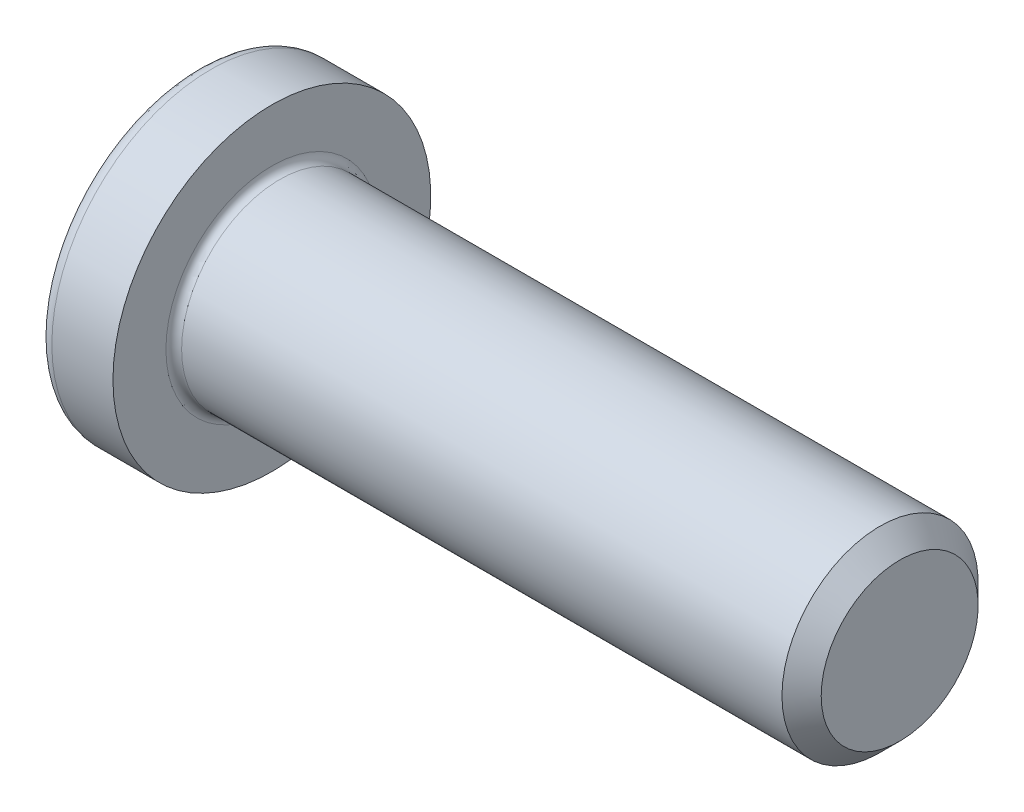
ISO-10303-21;
HEADER;
FILE_DESCRIPTION(('STEP AP214'),'2;1');
FILE_NAME('part.step','',(''),(''),'','','');
FILE_SCHEMA(('AUTOMOTIVE_DESIGN { 1 0 10303 214 1 1 1 1 }'));
ENDSEC;
DATA;
#1=APPLICATION_CONTEXT('core data for automotive mechanical design processes');
#2=APPLICATION_PROTOCOL_DEFINITION('international standard','automotive_design',2000,#1);
#3=PRODUCT_CONTEXT('',#1,'mechanical');
#4=PRODUCT('Part','Part','',(#3));
#5=PRODUCT_RELATED_PRODUCT_CATEGORY('part','',(#4));
#6=PRODUCT_DEFINITION_FORMATION('','',#4);
#7=PRODUCT_DEFINITION_CONTEXT('part definition',#1,'design');
#8=PRODUCT_DEFINITION('design','',#6,#7);
#9=PRODUCT_DEFINITION_SHAPE('','',#8);
#10=(LENGTH_UNIT() NAMED_UNIT(*) SI_UNIT(.MILLI.,.METRE.));
#11=(NAMED_UNIT(*) PLANE_ANGLE_UNIT() SI_UNIT($,.RADIAN.));
#12=(NAMED_UNIT(*) SI_UNIT($,.STERADIAN.) SOLID_ANGLE_UNIT());
#13=UNCERTAINTY_MEASURE_WITH_UNIT(LENGTH_MEASURE(1.E-05),#10,'distance_accuracy_value','');
#14=(GEOMETRIC_REPRESENTATION_CONTEXT(3) GLOBAL_UNCERTAINTY_ASSIGNED_CONTEXT((#13)) GLOBAL_UNIT_ASSIGNED_CONTEXT((#10,
#11,#12)) REPRESENTATION_CONTEXT('',''));
#15=CARTESIAN_POINT('',(0.,0.,0.));
#16=DIRECTION('',(0.,0.,1.));
#17=DIRECTION('',(1.,0.,0.));
#18=AXIS2_PLACEMENT_3D('',#15,#16,#17);
#19=CARTESIAN_POINT('',(0.,-2.3,-0.515));
#20=DIRECTION('',(0.,0.,-1.));
#21=DIRECTION('',(0.,1.,0.));
#22=AXIS2_PLACEMENT_3D('',#19,#20,#21);
#23=PLANE('',#22);
#24=CARTESIAN_POINT('',(0.0407077298750012,-0.870906525452036,-0.515));
#25=CARTESIAN_POINT('',(0.354940852306687,-0.845357451778325,-0.515));
#26=CARTESIAN_POINT('',(0.669154513681637,-0.819557879814467,-0.515));
#27=CARTESIAN_POINT('',(1.29751579937721,-0.767187026762987,-0.515));
#28=CARTESIAN_POINT('',(1.61166342402518,-0.74061574959621,-0.515));
#29=CARTESIAN_POINT('',(2.06391977623229,-0.701606822305633,-0.515));
#30=CARTESIAN_POINT('',(2.20206478172416,-0.689589654182128,-0.515));
#31=CARTESIAN_POINT('',(2.3402,-0.677460107392904,-0.515));
#32=B_SPLINE_CURVE_WITH_KNOTS('',3,(#24,#25,#26,#27,#28,#29,#30,#31),.UNSPECIFIED.,.F.,.F.,(4,2,
2,4),(0.,0.945811562931304,1.89161832126644,2.30761835122964),.UNSPECIFIED.);
#33=CARTESIAN_POINT('',(0.0788099820016241,-0.867809744562729,-0.515));
#34=VERTEX_POINT('',#33);
#35=CARTESIAN_POINT('',(2.34,-0.677477674908923,-0.515));
#36=VERTEX_POINT('',#35);
#37=EDGE_CURVE('E650',#34,#36,#32,.T.);
#38=ORIENTED_EDGE('',*,*,#37,.F.);
#39=CARTESIAN_POINT('',(6.5,0.,-0.515));
#40=DIRECTION('',(0.,0.,-1.));
#41=DIRECTION('',(-1.,0.,0.));
#42=AXIS2_PLACEMENT_3D('',#39,#40,#41);
#43=CIRCLE('',#42,6.47956595768574);
#44=CARTESIAN_POINT('',(0.367795782579366,-2.09304716522314,-0.515));
#45=VERTEX_POINT('',#44);
#46=EDGE_CURVE('E501',#45,#34,#43,.T.);
#47=ORIENTED_EDGE('',*,*,#46,.F.);
#48=CARTESIAN_POINT('',(0.,-2.3,-0.515));
#49=CARTESIAN_POINT('',(0.78,-1.86110641075358,-0.515));
#50=CARTESIAN_POINT('',(1.56,-1.42221282150716,-0.515));
#51=CARTESIAN_POINT('',(2.34,-0.983319232260742,-0.515));
#52=B_SPLINE_CURVE_WITH_KNOTS('',3,(#48,#49,#50,#51),.UNSPECIFIED.,.F.,.F.,(4,4),(0.,1.),.UNSPECIFIED.);
#53=CARTESIAN_POINT('',(2.34,-0.983319232260742,-0.515));
#54=VERTEX_POINT('',#53);
#55=EDGE_CURVE('E528',#45,#54,#52,.T.);
#56=ORIENTED_EDGE('',*,*,#55,.T.);
#57=DIRECTION('',(0.,1.,0.));
#58=VECTOR('',#57,1.);
#59=CARTESIAN_POINT('',(2.34,-0.983319232260742,-0.515));
#60=LINE('',#59,#58);
#61=EDGE_CURVE('E326',#54,#36,#60,.T.);
#62=ORIENTED_EDGE('',*,*,#61,.T.);
#63=EDGE_LOOP('',(#38,#47,#56,#62));
#64=FACE_BOUND('',#63,.T.);
#65=ADVANCED_FACE('F147',(#64),#23,.F.);
#66=CARTESIAN_POINT('',(0.,2.3,0.515));
#67=DIRECTION('',(0.,0.,1.));
#68=DIRECTION('',(0.,-1.,0.));
#69=AXIS2_PLACEMENT_3D('',#66,#67,#68);
#70=PLANE('',#69);
#71=CARTESIAN_POINT('',(2.3402,-0.677460107392904,0.515));
#72=CARTESIAN_POINT('',(2.07604901261303,-0.700650008011005,0.515));
#73=CARTESIAN_POINT('',(1.81186269028688,-0.723432576763624,0.515));
#74=CARTESIAN_POINT('',(1.28343513689715,-0.768342068511704,0.515));
#75=CARTESIAN_POINT('',(1.0191939060178,-0.790468993672425,0.515));
#76=CARTESIAN_POINT('',(0.635902690415945,-0.822202344310017,0.515));
#77=CARTESIAN_POINT('',(0.516869003870646,-0.832006645321113,0.515));
#78=CARTESIAN_POINT('',(0.278793917954696,-0.851523329351376,0.515));
#79=CARTESIAN_POINT('',(0.159752518572942,-0.861235712235126,0.515));
#80=CARTESIAN_POINT('',(0.0407077298750012,-0.870906525452036,0.515));
#81=B_SPLINE_CURVE_WITH_KNOTS('',3,(#71,#72,#73,#74,#75,#76,#77,#78,#79,#80),.UNSPECIFIED.,.F.,
.F.,(4,2,2,2,4),(0.,0.79549997175225,1.59099731607777,1.94930761919596,2.30761845011338),.UNSPECIFIED.);
#82=CARTESIAN_POINT('',(2.34,-0.677477674908923,0.515));
#83=VERTEX_POINT('',#82);
#84=CARTESIAN_POINT('',(0.0788099820016241,-0.867809744562729,0.515));
#85=VERTEX_POINT('',#84);
#86=EDGE_CURVE('E461',#83,#85,#81,.T.);
#87=ORIENTED_EDGE('',*,*,#86,.F.);
#88=DIRECTION('',(0.,-1.,0.));
#89=VECTOR('',#88,1.);
#90=CARTESIAN_POINT('',(2.34,0.983319232260742,0.515));
#91=LINE('',#90,#89);
#92=CARTESIAN_POINT('',(2.34,-0.983319232260743,0.515));
#93=VERTEX_POINT('',#92);
#94=EDGE_CURVE('E466',#83,#93,#91,.T.);
#95=ORIENTED_EDGE('',*,*,#94,.T.);
#96=CARTESIAN_POINT('',(0.,-2.3,0.515));
#97=CARTESIAN_POINT('',(0.78,-1.86110641075358,0.515));
#98=CARTESIAN_POINT('',(1.56,-1.42221282150716,0.515));
#99=CARTESIAN_POINT('',(2.34,-0.983319232260743,0.515));
#100=B_SPLINE_CURVE_WITH_KNOTS('',3,(#96,#97,#98,#99),.UNSPECIFIED.,.F.,.F.,(4,4),(0.,1.),.UNSPECIFIED.);
#101=CARTESIAN_POINT('',(0.367795782579365,-2.09304716522314,0.515));
#102=VERTEX_POINT('',#101);
#103=EDGE_CURVE('E550',#102,#93,#100,.T.);
#104=ORIENTED_EDGE('',*,*,#103,.F.);
#105=CARTESIAN_POINT('',(6.5,0.,0.514999999999999));
#106=DIRECTION('',(0.,0.,1.));
#107=DIRECTION('',(1.,0.,0.));
#108=AXIS2_PLACEMENT_3D('',#105,#106,#107);
#109=CIRCLE('',#108,6.47956595768574);
#110=EDGE_CURVE('E170',#85,#102,#109,.T.);
#111=ORIENTED_EDGE('',*,*,#110,.F.);
#112=EDGE_LOOP('',(#87,#95,#104,#111));
#113=FACE_BOUND('',#112,.T.);
#114=ADVANCED_FACE('F278',(#113),#70,.F.);
#115=CARTESIAN_POINT('',(6.5,0.,0.));
#116=DIRECTION('',(-1.,0.,0.));
#117=DIRECTION('',(0.,1.,0.));
#118=AXIS2_PLACEMENT_3D('',#115,#116,#117);
#119=SPHERICAL_SURFACE('',#118,6.5);
#120=CARTESIAN_POINT('',(1.30476991069664,0.,0.));
#121=DIRECTION('',(-1.,0.,0.));
#122=DIRECTION('',(0.,0.,1.));
#123=AXIS2_PLACEMENT_3D('',#120,#121,#122);
#124=CIRCLE('',#123,3.90635179153094);
#125=CARTESIAN_POINT('',(1.30476991069664,0.,3.90635179153094));
#126=VERTEX_POINT('',#125);
#127=EDGE_CURVE('E521',#126,#126,#124,.T.);
#128=ORIENTED_EDGE('',*,*,#127,.T.);
#129=EDGE_LOOP('',(#128));
#130=FACE_BOUND('',#129,.T.);
#131=CARTESIAN_POINT('',(0.0788099820016241,0.,0.));
#132=DIRECTION('',(1.,0.,0.));
#133=DIRECTION('',(0.,0.,-1.));
#134=AXIS2_PLACEMENT_3D('',#131,#132,#133);
#135=CIRCLE('',#134,1.0091178091571);
#136=CARTESIAN_POINT('',(0.0788099820016967,-0.515000000000003,-0.867809744563021));
#137=VERTEX_POINT('',#136);
#138=EDGE_CURVE('E653',#137,#34,#135,.F.);
#139=ORIENTED_EDGE('',*,*,#138,.F.);
#140=CARTESIAN_POINT('',(6.5,-0.515,0.));
#141=DIRECTION('',(0.,-1.,0.));
#142=DIRECTION('',(0.,0.,-1.));
#143=AXIS2_PLACEMENT_3D('',#140,#141,#142);
#144=CIRCLE('',#143,6.47956595768575);
#145=CARTESIAN_POINT('',(0.367795782579367,-0.515000000000007,-2.09304716522313));
#146=VERTEX_POINT('',#145);
#147=EDGE_CURVE('E327',#137,#146,#144,.T.);
#148=ORIENTED_EDGE('',*,*,#147,.T.);
#149=CARTESIAN_POINT('',(5.91986493552861,0.,1.03101380693356));
#150=DIRECTION('',(0.490383108048238,0.,-0.871506974923868));
#151=DIRECTION('',(-0.871506974923868,0.,-0.490383108048238));
#152=AXIS2_PLACEMENT_3D('',#149,#150,#151);
#153=CIRCLE('',#152,6.39143597612329);
#154=CARTESIAN_POINT('',(0.367795782579367,0.514999999999993,-2.09304716522314));
#155=VERTEX_POINT('',#154);
#156=EDGE_CURVE('E489',#146,#155,#153,.T.);
#157=ORIENTED_EDGE('',*,*,#156,.T.);
#158=CARTESIAN_POINT('',(6.5,0.514999999999999,0.));
#159=DIRECTION('',(0.,1.,0.));
#160=DIRECTION('',(0.,0.,1.));
#161=AXIS2_PLACEMENT_3D('',#158,#159,#160);
#162=CIRCLE('',#161,6.47956595768574);
#163=CARTESIAN_POINT('',(0.078809982001625,0.514999999999997,-0.86780974456273));
#164=VERTEX_POINT('',#163);
#165=EDGE_CURVE('E565',#155,#164,#162,.T.);
#166=ORIENTED_EDGE('',*,*,#165,.T.);
#167=CARTESIAN_POINT('',(0.0788099820016241,0.867809744562719,-0.515));
#168=VERTEX_POINT('',#167);
#169=EDGE_CURVE('E162',#168,#164,#135,.F.);
#170=ORIENTED_EDGE('',*,*,#169,.F.);
#171=CARTESIAN_POINT('',(0.367795782579368,2.09304716522314,-0.515));
#172=VERTEX_POINT('',#171);
#173=EDGE_CURVE('E311',#168,#172,#43,.T.);
#174=ORIENTED_EDGE('',*,*,#173,.T.);
#175=CARTESIAN_POINT('',(5.91986493552861,-1.03101380693356,0.));
#176=DIRECTION('',(0.490383108048238,0.871506974923868,0.));
#177=DIRECTION('',(-0.871506974923868,0.490383108048238,0.));
#178=AXIS2_PLACEMENT_3D('',#175,#176,#177);
#179=CIRCLE('',#178,6.3914359761233);
#180=CARTESIAN_POINT('',(0.367795782579368,2.09304716522313,0.515));
#181=VERTEX_POINT('',#180);
#182=EDGE_CURVE('E496',#172,#181,#179,.T.);
#183=ORIENTED_EDGE('',*,*,#182,.T.);
#184=CARTESIAN_POINT('',(0.0788099820016241,0.867809744562719,0.515));
#185=VERTEX_POINT('',#184);
#186=EDGE_CURVE('E506',#181,#185,#109,.T.);
#187=ORIENTED_EDGE('',*,*,#186,.T.);
#188=CARTESIAN_POINT('',(0.0788099820016975,0.515000000000003,0.867809744563021));
#189=VERTEX_POINT('',#188);
#190=EDGE_CURVE('E660',#189,#185,#135,.F.);
#191=ORIENTED_EDGE('',*,*,#190,.F.);
#192=CARTESIAN_POINT('',(0.367795782579367,0.515000000000007,2.09304716522313));
#193=VERTEX_POINT('',#192);
#194=EDGE_CURVE('E601',#189,#193,#162,.T.);
#195=ORIENTED_EDGE('',*,*,#194,.T.);
#196=CARTESIAN_POINT('',(5.91986493552861,0.,-1.03101380693356));
#197=DIRECTION('',(0.490383108048237,0.,0.871506974923868));
#198=DIRECTION('',(0.871506974923868,0.,-0.490383108048237));
#199=AXIS2_PLACEMENT_3D('',#196,#197,#198);
#200=CIRCLE('',#199,6.39143597612329);
#201=CARTESIAN_POINT('',(0.367795782579367,-0.514999999999993,2.09304716522314));
#202=VERTEX_POINT('',#201);
#203=EDGE_CURVE('E492',#193,#202,#200,.T.);
#204=ORIENTED_EDGE('',*,*,#203,.T.);
#205=CARTESIAN_POINT('',(0.0788099820016973,-0.514999999999997,0.867809744563024));
#206=VERTEX_POINT('',#205);
#207=EDGE_CURVE('E559',#202,#206,#144,.T.);
#208=ORIENTED_EDGE('',*,*,#207,.T.);
#209=EDGE_CURVE('E686',#85,#206,#135,.F.);
#210=ORIENTED_EDGE('',*,*,#209,.F.);
#211=ORIENTED_EDGE('',*,*,#110,.T.);
#212=CARTESIAN_POINT('',(5.91986493552861,1.03101380693355,0.));
#213=DIRECTION('',(0.490383108048237,-0.871506974923868,0.));
#214=DIRECTION('',(0.871506974923868,0.490383108048237,0.));
#215=AXIS2_PLACEMENT_3D('',#212,#213,#214);
#216=CIRCLE('',#215,6.39143597612329);
#217=EDGE_CURVE('E504',#102,#45,#216,.T.);
#218=ORIENTED_EDGE('',*,*,#217,.T.);
#219=ORIENTED_EDGE('',*,*,#46,.T.);
#220=EDGE_LOOP('',(#139,#148,#157,#166,#170,#174,#183,#187,#191,#195,#204,#208,#210,#211,#218,#219));
#221=FACE_BOUND('',#220,.T.);
#222=ADVANCED_FACE('F285',(#130,#221),#119,.T.);
#223=CARTESIAN_POINT('',(2.3402,0.677460107392904,-0.515));
#224=CARTESIAN_POINT('',(2.07604901261303,0.700650008011005,-0.515));
#225=CARTESIAN_POINT('',(1.81186269028688,0.723432576763624,-0.515));
#226=CARTESIAN_POINT('',(1.28343513689715,0.768342068511704,-0.515));
#227=CARTESIAN_POINT('',(1.0191939060178,0.790468993672425,-0.515));
#228=CARTESIAN_POINT('',(0.635902690415945,0.822202344310017,-0.515));
#229=CARTESIAN_POINT('',(0.516869003870646,0.832006645321112,-0.515));
#230=CARTESIAN_POINT('',(0.278793917954696,0.851523329351376,-0.515));
#231=CARTESIAN_POINT('',(0.159752518572942,0.861235712235126,-0.515));
#232=CARTESIAN_POINT('',(0.0407077298750021,0.870906525452036,-0.515));
#233=B_SPLINE_CURVE_WITH_KNOTS('',3,(#223,#224,#225,#226,#227,#228,#229,#230,#231,#232),
.UNSPECIFIED.,.F.,.F.,(4,2,2,2,4),(0.,0.795499971752251,1.59099731607777,1.94930761919595,
2.30761845011338),.UNSPECIFIED.);
#234=CARTESIAN_POINT('',(2.34,0.677477674908923,-0.515));
#235=VERTEX_POINT('',#234);
#236=EDGE_CURVE('E305',#235,#168,#233,.T.);
#237=ORIENTED_EDGE('',*,*,#236,.F.);
#238=CARTESIAN_POINT('',(2.34,0.983319232260742,-0.515));
#239=VERTEX_POINT('',#238);
#240=EDGE_CURVE('E308',#235,#239,#60,.T.);
#241=ORIENTED_EDGE('',*,*,#240,.T.);
#242=CARTESIAN_POINT('',(0.,2.3,-0.515));
#243=CARTESIAN_POINT('',(0.78,1.86110641075358,-0.515));
#244=CARTESIAN_POINT('',(1.56,1.42221282150716,-0.515));
#245=CARTESIAN_POINT('',(2.34,0.983319232260742,-0.515));
#246=B_SPLINE_CURVE_WITH_KNOTS('',3,(#242,#243,#244,#245),.UNSPECIFIED.,.F.,.F.,(4,4),(0.,1.),.UNSPECIFIED.);
#247=EDGE_CURVE('E525',#172,#239,#246,.T.);
#248=ORIENTED_EDGE('',*,*,#247,.F.);
#249=ORIENTED_EDGE('',*,*,#173,.F.);
#250=EDGE_LOOP('',(#237,#241,#248,#249));
#251=FACE_BOUND('',#250,.T.);
#252=ADVANCED_FACE('F281',(#251),#23,.F.);
#253=CARTESIAN_POINT('',(0.0407077298750021,0.870906525452036,0.515));
#254=CARTESIAN_POINT('',(0.354940852306688,0.845357451778325,0.515));
#255=CARTESIAN_POINT('',(0.669154513681638,0.819557879814467,0.515));
#256=CARTESIAN_POINT('',(1.29751579937721,0.767187026762987,0.515));
#257=CARTESIAN_POINT('',(1.61166342402518,0.74061574959621,0.515));
#258=CARTESIAN_POINT('',(2.06391977623229,0.701606822305633,0.515));
#259=CARTESIAN_POINT('',(2.20206478172416,0.689589654182128,0.515));
#260=CARTESIAN_POINT('',(2.3402,0.677460107392904,0.515));
#261=B_SPLINE_CURVE_WITH_KNOTS('',3,(#253,#254,#255,#256,#257,#258,#259,#260),.UNSPECIFIED.,.F.,
.F.,(4,2,2,4),(0.,0.945811562931304,1.89161832126644,2.30761835122964),.UNSPECIFIED.);
#262=CARTESIAN_POINT('',(2.34,0.677477674908923,0.515));
#263=VERTEX_POINT('',#262);
#264=EDGE_CURVE('E666',#185,#263,#261,.T.);
#265=ORIENTED_EDGE('',*,*,#264,.F.);
#266=ORIENTED_EDGE('',*,*,#186,.F.);
#267=CARTESIAN_POINT('',(0.,2.3,0.515));
#268=CARTESIAN_POINT('',(0.78,1.86110641075358,0.515));
#269=CARTESIAN_POINT('',(1.56,1.42221282150716,0.515));
#270=CARTESIAN_POINT('',(2.34,0.983319232260742,0.515));
#271=B_SPLINE_CURVE_WITH_KNOTS('',3,(#267,#268,#269,#270),.UNSPECIFIED.,.F.,.F.,(4,4),(0.,1.),.UNSPECIFIED.);
#272=CARTESIAN_POINT('',(2.34,0.983319232260742,0.515));
#273=VERTEX_POINT('',#272);
#274=EDGE_CURVE('E524',#181,#273,#271,.T.);
#275=ORIENTED_EDGE('',*,*,#274,.T.);
#276=EDGE_CURVE('E485',#273,#263,#91,.T.);
#277=ORIENTED_EDGE('',*,*,#276,.T.);
#278=EDGE_LOOP('',(#265,#266,#275,#277));
#279=FACE_BOUND('',#278,.T.);
#280=ADVANCED_FACE('F288',(#279),#70,.F.);
#281=CARTESIAN_POINT('',(2.34,0.,0.));
#282=DIRECTION('',(-1.,0.,0.));
#283=DIRECTION('',(0.,0.,1.));
#284=AXIS2_PLACEMENT_3D('',#281,#282,#283);
#285=PLANE('',#284);
#286=ORIENTED_EDGE('',*,*,#94,.F.);
#287=CARTESIAN_POINT('',(2.34,0.,0.));
#288=DIRECTION('',(-1.,0.,0.));
#289=DIRECTION('',(0.,0.,1.));
#290=AXIS2_PLACEMENT_3D('',#287,#288,#289);
#291=CIRCLE('',#290,0.851);
#292=EDGE_CURVE('E721',#36,#83,#291,.T.);
#293=ORIENTED_EDGE('',*,*,#292,.F.);
#294=ORIENTED_EDGE('',*,*,#61,.F.);
#295=DIRECTION('',(0.,0.,-1.));
#296=VECTOR('',#295,1.);
#297=CARTESIAN_POINT('',(2.34,-0.983319232260742,-0.515));
#298=LINE('',#297,#296);
#299=EDGE_CURVE('E482',#93,#54,#298,.T.);
#300=ORIENTED_EDGE('',*,*,#299,.F.);
#301=EDGE_LOOP('',(#286,#293,#294,#300));
#302=FACE_BOUND('',#301,.T.);
#303=ADVANCED_FACE('F299',(#302),#285,.T.);
#304=DIRECTION('',(0.,0.,-1.));
#305=VECTOR('',#304,1.);
#306=CARTESIAN_POINT('',(2.34,-0.514999999999997,0.983319232260744));
#307=LINE('',#306,#305);
#308=CARTESIAN_POINT('',(2.34,-0.515000000000002,-0.677477674908921));
#309=VERTEX_POINT('',#308);
#310=CARTESIAN_POINT('',(2.34,-0.515000000000004,-0.983319232260741));
#311=VERTEX_POINT('',#310);
#312=EDGE_CURVE('E424',#309,#311,#307,.T.);
#313=ORIENTED_EDGE('',*,*,#312,.F.);
#314=CARTESIAN_POINT('',(2.34,0.514999999999998,-0.677477674908925));
#315=VERTEX_POINT('',#314);
#316=EDGE_CURVE('E737',#315,#309,#291,.T.);
#317=ORIENTED_EDGE('',*,*,#316,.F.);
#318=DIRECTION('',(0.,0.,1.));
#319=VECTOR('',#318,1.);
#320=CARTESIAN_POINT('',(2.34,0.514999999999997,-0.983319232260744));
#321=LINE('',#320,#319);
#322=CARTESIAN_POINT('',(2.34,0.514999999999996,-0.983319232260744));
#323=VERTEX_POINT('',#322);
#324=EDGE_CURVE('E478',#323,#315,#321,.T.);
#325=ORIENTED_EDGE('',*,*,#324,.F.);
#326=DIRECTION('',(0.,1.,0.));
#327=VECTOR('',#326,1.);
#328=CARTESIAN_POINT('',(2.34,0.514999999999997,-0.983319232260744));
#329=LINE('',#328,#327);
#330=EDGE_CURVE('E457',#311,#323,#329,.T.);
#331=ORIENTED_EDGE('',*,*,#330,.F.);
#332=EDGE_LOOP('',(#313,#317,#325,#331));
#333=FACE_BOUND('',#332,.T.);
#334=ADVANCED_FACE('F352',(#333),#285,.T.);
#335=ORIENTED_EDGE('',*,*,#240,.F.);
#336=EDGE_CURVE('E321',#263,#235,#291,.T.);
#337=ORIENTED_EDGE('',*,*,#336,.F.);
#338=ORIENTED_EDGE('',*,*,#276,.F.);
#339=DIRECTION('',(0.,0.,1.));
#340=VECTOR('',#339,1.);
#341=CARTESIAN_POINT('',(2.34,0.983319232260742,0.515));
#342=LINE('',#341,#340);
#343=EDGE_CURVE('E324',#239,#273,#342,.T.);
#344=ORIENTED_EDGE('',*,*,#343,.F.);
#345=EDGE_LOOP('',(#335,#337,#338,#344));
#346=FACE_BOUND('',#345,.T.);
#347=ADVANCED_FACE('F318',(#346),#285,.T.);
#348=CARTESIAN_POINT('',(2.34,0.515000000000002,0.677477674908921));
#349=VERTEX_POINT('',#348);
#350=CARTESIAN_POINT('',(2.34,0.515000000000003,0.983319232260741));
#351=VERTEX_POINT('',#350);
#352=EDGE_CURVE('E431',#349,#351,#321,.T.);
#353=ORIENTED_EDGE('',*,*,#352,.F.);
#354=CARTESIAN_POINT('',(2.34,-0.514999999999998,0.677477674908925));
#355=VERTEX_POINT('',#354);
#356=EDGE_CURVE('E453',#355,#349,#291,.T.);
#357=ORIENTED_EDGE('',*,*,#356,.F.);
#358=CARTESIAN_POINT('',(2.34,-0.514999999999997,0.983319232260744));
#359=VERTEX_POINT('',#358);
#360=EDGE_CURVE('E450',#359,#355,#307,.T.);
#361=ORIENTED_EDGE('',*,*,#360,.F.);
#362=DIRECTION('',(0.,-1.,0.));
#363=VECTOR('',#362,1.);
#364=CARTESIAN_POINT('',(2.34,-0.514999999999997,0.983319232260744));
#365=LINE('',#364,#363);
#366=EDGE_CURVE('E452',#351,#359,#365,.T.);
#367=ORIENTED_EDGE('',*,*,#366,.F.);
#368=EDGE_LOOP('',(#353,#357,#361,#367));
#369=FACE_BOUND('',#368,.T.);
#370=ADVANCED_FACE('F354',(#369),#285,.T.);
#371=CARTESIAN_POINT('',(0.,-0.514999999999992,2.3));
#372=DIRECTION('',(0.,-1.,0.));
#373=DIRECTION('',(0.,0.,-1.));
#374=AXIS2_PLACEMENT_3D('',#371,#372,#373);
#375=PLANE('',#374);
#376=CARTESIAN_POINT('',(0.0407077298750012,-0.514999999999997,0.870906525452038));
#377=CARTESIAN_POINT('',(0.354940852306686,-0.514999999999997,0.845357451778327));
#378=CARTESIAN_POINT('',(0.669154513681637,-0.514999999999997,0.819557879814469));
#379=CARTESIAN_POINT('',(1.29751579937721,-0.514999999999997,0.767187026762989));
#380=CARTESIAN_POINT('',(1.61166342402518,-0.514999999999997,0.740615749596212));
#381=CARTESIAN_POINT('',(2.06391977623229,-0.514999999999997,0.701606822305635));
#382=CARTESIAN_POINT('',(2.20206478172416,-0.514999999999998,0.689589654182129));
#383=CARTESIAN_POINT('',(2.3402,-0.514999999999998,0.677460107392906));
#384=B_SPLINE_CURVE_WITH_KNOTS('',3,(#376,#377,#378,#379,#380,#381,#382,#383),.UNSPECIFIED.,.F.,
.F.,(4,2,2,4),(0.,0.945811562931304,1.89161832126644,2.30761835122964),.UNSPECIFIED.);
#385=EDGE_CURVE('E668',#206,#355,#384,.T.);
#386=ORIENTED_EDGE('',*,*,#385,.F.);
#387=ORIENTED_EDGE('',*,*,#207,.F.);
#388=CARTESIAN_POINT('',(0.,-0.514999999999992,2.3));
#389=CARTESIAN_POINT('',(0.78,-0.514999999999994,1.86110641075358));
#390=CARTESIAN_POINT('',(1.56,-0.514999999999995,1.42221282150716));
#391=CARTESIAN_POINT('',(2.34,-0.514999999999996,0.983319232260744));
#392=B_SPLINE_CURVE_WITH_KNOTS('',3,(#388,#389,#390,#391),.UNSPECIFIED.,.F.,.F.,(4,4),(0.,1.),.UNSPECIFIED.);
#393=EDGE_CURVE('E566',#202,#359,#392,.T.);
#394=ORIENTED_EDGE('',*,*,#393,.T.);
#395=ORIENTED_EDGE('',*,*,#360,.T.);
#396=EDGE_LOOP('',(#386,#387,#394,#395));
#397=FACE_BOUND('',#396,.T.);
#398=ADVANCED_FACE('F630',(#397),#375,.F.);
#399=CARTESIAN_POINT('',(0.,0.514999999999992,-2.3));
#400=DIRECTION('',(0.,1.,0.));
#401=DIRECTION('',(0.,0.,1.));
#402=AXIS2_PLACEMENT_3D('',#399,#400,#401);
#403=PLANE('',#402);
#404=CARTESIAN_POINT('',(2.3402,0.515000000000002,0.677460107392902));
#405=CARTESIAN_POINT('',(2.07604901261303,0.515000000000002,0.700650008011004));
#406=CARTESIAN_POINT('',(1.81186269028688,0.515000000000002,0.723432576763622));
#407=CARTESIAN_POINT('',(1.28343513689715,0.515000000000003,0.768342068511702));
#408=CARTESIAN_POINT('',(1.0191939060178,0.515000000000003,0.790468993672423));
#409=CARTESIAN_POINT('',(0.635902690415946,0.515000000000003,0.822202344310016));
#410=CARTESIAN_POINT('',(0.516869003870646,0.515000000000003,0.832006645321111));
#411=CARTESIAN_POINT('',(0.278793917954696,0.515000000000003,0.851523329351374));
#412=CARTESIAN_POINT('',(0.159752518572942,0.515000000000003,0.861235712235124));
#413=CARTESIAN_POINT('',(0.0407077298750021,0.515000000000003,0.870906525452034));
#414=B_SPLINE_CURVE_WITH_KNOTS('',3,(#404,#405,#406,#407,#408,#409,#410,#411,#412,#413),
.UNSPECIFIED.,.F.,.F.,(4,2,2,2,4),(0.,0.79549997175225,1.59099731607777,1.94930761919595,
2.30761845011338),.UNSPECIFIED.);
#415=EDGE_CURVE('E652',#349,#189,#414,.T.);
#416=ORIENTED_EDGE('',*,*,#415,.F.);
#417=ORIENTED_EDGE('',*,*,#352,.T.);
#418=CARTESIAN_POINT('',(0.,0.515000000000008,2.3));
#419=CARTESIAN_POINT('',(0.78,0.515000000000006,1.86110641075358));
#420=CARTESIAN_POINT('',(1.56,0.515000000000005,1.42221282150716));
#421=CARTESIAN_POINT('',(2.34,0.515000000000003,0.983319232260741));
#422=B_SPLINE_CURVE_WITH_KNOTS('',3,(#418,#419,#420,#421),.UNSPECIFIED.,.F.,.F.,(4,4),(0.,1.),.UNSPECIFIED.);
#423=EDGE_CURVE('E570',#193,#351,#422,.T.);
#424=ORIENTED_EDGE('',*,*,#423,.F.);
#425=ORIENTED_EDGE('',*,*,#194,.F.);
#426=EDGE_LOOP('',(#416,#417,#424,#425));
#427=FACE_BOUND('',#426,.T.);
#428=ADVANCED_FACE('F355',(#427),#403,.F.);
#429=CARTESIAN_POINT('',(2.3402,-0.515000000000002,-0.677460107392902));
#430=CARTESIAN_POINT('',(2.07604901261303,-0.515000000000002,-0.700650008011003));
#431=CARTESIAN_POINT('',(1.81186269028688,-0.515000000000002,-0.723432576763622));
#432=CARTESIAN_POINT('',(1.28343513689715,-0.515000000000003,-0.768342068511702));
#433=CARTESIAN_POINT('',(1.0191939060178,-0.515000000000003,-0.790468993672423));
#434=CARTESIAN_POINT('',(0.635902690415945,-0.515000000000003,-0.822202344310016));
#435=CARTESIAN_POINT('',(0.516869003870646,-0.515000000000003,-0.832006645321111));
#436=CARTESIAN_POINT('',(0.278793917954695,-0.515000000000003,-0.851523329351374));
#437=CARTESIAN_POINT('',(0.159752518572942,-0.515000000000003,-0.861235712235124));
#438=CARTESIAN_POINT('',(0.0407077298750012,-0.515000000000003,-0.870906525452034));
#439=B_SPLINE_CURVE_WITH_KNOTS('',3,(#429,#430,#431,#432,#433,#434,#435,#436,#437,#438),
.UNSPECIFIED.,.F.,.F.,(4,2,2,2,4),(0.,0.795499971752251,1.59099731607777,1.94930761919596,
2.30761845011338),.UNSPECIFIED.);
#440=EDGE_CURVE('E312',#309,#137,#439,.T.);
#441=ORIENTED_EDGE('',*,*,#440,.F.);
#442=ORIENTED_EDGE('',*,*,#312,.T.);
#443=CARTESIAN_POINT('',(0.,-0.515000000000008,-2.3));
#444=CARTESIAN_POINT('',(0.78,-0.515000000000007,-1.86110641075358));
#445=CARTESIAN_POINT('',(1.56,-0.515000000000005,-1.42221282150716));
#446=CARTESIAN_POINT('',(2.34,-0.515000000000004,-0.983319232260741));
#447=B_SPLINE_CURVE_WITH_KNOTS('',3,(#443,#444,#445,#446),.UNSPECIFIED.,.F.,.F.,(4,4),(0.,1.),.UNSPECIFIED.);
#448=EDGE_CURVE('E569',#146,#311,#447,.T.);
#449=ORIENTED_EDGE('',*,*,#448,.F.);
#450=ORIENTED_EDGE('',*,*,#147,.F.);
#451=EDGE_LOOP('',(#441,#442,#449,#450));
#452=FACE_BOUND('',#451,.T.);
#453=ADVANCED_FACE('F633',(#452),#375,.F.);
#454=CARTESIAN_POINT('',(0.0407077298750021,0.514999999999997,-0.870906525452038));
#455=CARTESIAN_POINT('',(0.354940852306688,0.514999999999997,-0.845357451778327));
#456=CARTESIAN_POINT('',(0.669154513681638,0.514999999999997,-0.819557879814469));
#457=CARTESIAN_POINT('',(1.29751579937721,0.514999999999997,-0.767187026762989));
#458=CARTESIAN_POINT('',(1.61166342402518,0.514999999999997,-0.740615749596212));
#459=CARTESIAN_POINT('',(2.06391977623229,0.514999999999997,-0.701606822305635));
#460=CARTESIAN_POINT('',(2.20206478172416,0.514999999999998,-0.689589654182129));
#461=CARTESIAN_POINT('',(2.3402,0.514999999999998,-0.677460107392906));
#462=B_SPLINE_CURVE_WITH_KNOTS('',3,(#454,#455,#456,#457,#458,#459,#460,#461),.UNSPECIFIED.,.F.,
.F.,(4,2,2,4),(0.,0.945811562931304,1.89161832126644,2.30761835122964),.UNSPECIFIED.);
#463=EDGE_CURVE('E411',#164,#315,#462,.T.);
#464=ORIENTED_EDGE('',*,*,#463,.F.);
#465=ORIENTED_EDGE('',*,*,#165,.F.);
#466=CARTESIAN_POINT('',(0.,0.514999999999992,-2.3));
#467=CARTESIAN_POINT('',(0.78,0.514999999999994,-1.86110641075358));
#468=CARTESIAN_POINT('',(1.56,0.514999999999995,-1.42221282150716));
#469=CARTESIAN_POINT('',(2.34,0.514999999999996,-0.983319232260744));
#470=B_SPLINE_CURVE_WITH_KNOTS('',3,(#466,#467,#468,#469),.UNSPECIFIED.,.F.,.F.,(4,4),(0.,1.),.UNSPECIFIED.);
#471=EDGE_CURVE('E599',#155,#323,#470,.T.);
#472=ORIENTED_EDGE('',*,*,#471,.T.);
#473=ORIENTED_EDGE('',*,*,#324,.T.);
#474=EDGE_LOOP('',(#464,#465,#472,#473));
#475=FACE_BOUND('',#474,.T.);
#476=ADVANCED_FACE('F609',(#475),#403,.F.);
#477=CARTESIAN_POINT('',(-25.4,0.,0.));
#478=DIRECTION('',(-1.,0.,0.));
#479=DIRECTION('',(0.,0.,1.));
#480=AXIS2_PLACEMENT_3D('',#477,#478,#479);
#481=CYLINDRICAL_SURFACE('',#480,2.5);
#482=CARTESIAN_POINT('',(18.65,0.,0.));
#483=DIRECTION('',(-1.,0.,0.));
#484=DIRECTION('',(0.,0.,1.));
#485=AXIS2_PLACEMENT_3D('',#482,#483,#484);
#486=CIRCLE('',#485,2.5);
#487=CARTESIAN_POINT('',(18.65,0.,2.5));
#488=VERTEX_POINT('',#487);
#489=EDGE_CURVE('E155',#488,#488,#486,.T.);
#490=ORIENTED_EDGE('',*,*,#489,.T.);
#491=EDGE_LOOP('',(#490));
#492=FACE_BOUND('',#491,.T.);
#493=CARTESIAN_POINT('',(3.35,0.,0.));
#494=DIRECTION('',(-1.,0.,0.));
#495=DIRECTION('',(0.,0.,1.));
#496=AXIS2_PLACEMENT_3D('',#493,#494,#495);
#497=CIRCLE('',#496,2.5);
#498=CARTESIAN_POINT('',(3.35,0.,2.5));
#499=VERTEX_POINT('',#498);
#500=EDGE_CURVE('E509',#499,#499,#497,.F.);
#501=ORIENTED_EDGE('',*,*,#500,.T.);
#502=EDGE_LOOP('',(#501));
#503=FACE_BOUND('',#502,.T.);
#504=ADVANCED_FACE('F709',(#492,#503),#481,.T.);
#505=CARTESIAN_POINT('',(3.15,2.5,0.));
#506=DIRECTION('',(-1.,0.,0.));
#507=DIRECTION('',(0.,0.,1.));
#508=AXIS2_PLACEMENT_3D('',#505,#506,#507);
#509=PLANE('',#508);
#510=CARTESIAN_POINT('',(3.15,0.,0.));
#511=DIRECTION('',(-1.,0.,0.));
#512=DIRECTION('',(0.,0.,1.));
#513=AXIS2_PLACEMENT_3D('',#510,#511,#512);
#514=CIRCLE('',#513,2.7);
#515=CARTESIAN_POINT('',(3.15,0.,2.7));
#516=VERTEX_POINT('',#515);
#517=EDGE_CURVE('E512',#516,#516,#514,.T.);
#518=ORIENTED_EDGE('',*,*,#517,.T.);
#519=EDGE_LOOP('',(#518));
#520=FACE_BOUND('',#519,.T.);
#521=CARTESIAN_POINT('',(3.15,0.,0.));
#522=DIRECTION('',(-1.,0.,0.));
#523=DIRECTION('',(0.,0.,1.));
#524=AXIS2_PLACEMENT_3D('',#521,#522,#523);
#525=CIRCLE('',#524,4.05);
#526=CARTESIAN_POINT('',(3.15,0.,4.05));
#527=VERTEX_POINT('',#526);
#528=EDGE_CURVE('E515',#527,#527,#525,.T.);
#529=ORIENTED_EDGE('',*,*,#528,.F.);
#530=EDGE_LOOP('',(#529));
#531=FACE_BOUND('',#530,.T.);
#532=ADVANCED_FACE('F797',(#520,#531),#509,.F.);
#533=CARTESIAN_POINT('',(-25.4,0.,0.));
#534=DIRECTION('',(-1.,0.,0.));
#535=DIRECTION('',(0.,0.,1.));
#536=AXIS2_PLACEMENT_3D('',#533,#534,#535);
#537=CYLINDRICAL_SURFACE('',#536,4.05);
#538=CARTESIAN_POINT('',(1.59250573102729,0.,0.));
#539=DIRECTION('',(-1.,0.,0.));
#540=DIRECTION('',(0.,0.,1.));
#541=AXIS2_PLACEMENT_3D('',#538,#539,#540);
#542=CIRCLE('',#541,4.05);
#543=CARTESIAN_POINT('',(1.59250573102729,0.,4.05));
#544=VERTEX_POINT('',#543);
#545=EDGE_CURVE('E518',#544,#544,#542,.T.);
#546=ORIENTED_EDGE('',*,*,#545,.F.);
#547=EDGE_LOOP('',(#546));
#548=FACE_BOUND('',#547,.T.);
#549=ORIENTED_EDGE('',*,*,#528,.T.);
#550=EDGE_LOOP('',(#549));
#551=FACE_BOUND('',#550,.T.);
#552=ADVANCED_FACE('F800',(#548,#551),#537,.T.);
#553=CARTESIAN_POINT('',(1.59250573102729,0.,0.));
#554=DIRECTION('',(-1.,0.,0.));
#555=DIRECTION('',(0.,0.,1.));
#556=AXIS2_PLACEMENT_3D('',#553,#554,#555);
#557=TOROIDAL_SURFACE('',#556,3.69,0.36);
#558=ORIENTED_EDGE('',*,*,#127,.F.);
#559=EDGE_LOOP('',(#558));
#560=FACE_BOUND('',#559,.T.);
#561=ORIENTED_EDGE('',*,*,#545,.T.);
#562=EDGE_LOOP('',(#561));
#563=FACE_BOUND('',#562,.T.);
#564=ADVANCED_FACE('F790',(#560,#563),#557,.T.);
#565=CARTESIAN_POINT('',(19.15,2.5,0.));
#566=DIRECTION('',(-1.,0.,0.));
#567=DIRECTION('',(0.,0.,1.));
#568=AXIS2_PLACEMENT_3D('',#565,#566,#567);
#569=PLANE('',#568);
#570=CARTESIAN_POINT('',(19.15,0.,0.));
#571=DIRECTION('',(-1.,0.,0.));
#572=DIRECTION('',(0.,0.,1.));
#573=AXIS2_PLACEMENT_3D('',#570,#571,#572);
#574=CIRCLE('',#573,1.99999999999999);
#575=CARTESIAN_POINT('',(19.15,0.,1.99999999999999));
#576=VERTEX_POINT('',#575);
#577=EDGE_CURVE('E13',#576,#576,#574,.F.);
#578=ORIENTED_EDGE('',*,*,#577,.T.);
#579=EDGE_LOOP('',(#578));
#580=FACE_BOUND('',#579,.T.);
#581=ADVANCED_FACE('F678',(#580),#569,.F.);
#582=CARTESIAN_POINT('',(3.35,0.,0.));
#583=DIRECTION('',(-1.,0.,0.));
#584=DIRECTION('',(0.,0.,1.));
#585=AXIS2_PLACEMENT_3D('',#582,#583,#584);
#586=TOROIDAL_SURFACE('',#585,2.7,0.2);
#587=ORIENTED_EDGE('',*,*,#500,.F.);
#588=EDGE_LOOP('',(#587));
#589=FACE_BOUND('',#588,.T.);
#590=ORIENTED_EDGE('',*,*,#517,.F.);
#591=EDGE_LOOP('',(#590));
#592=FACE_BOUND('',#591,.T.);
#593=ADVANCED_FACE('F782',(#589,#592),#586,.F.);
#594=CARTESIAN_POINT('',(0.,2.3,-0.515));
#595=DIRECTION('',(0.490383108048238,0.871506974923868,0.));
#596=DIRECTION('',(0.,0.,1.));
#597=AXIS2_PLACEMENT_3D('',#594,#595,#596);
#598=PLANE('',#597);
#599=ORIENTED_EDGE('',*,*,#247,.T.);
#600=ORIENTED_EDGE('',*,*,#343,.T.);
#601=ORIENTED_EDGE('',*,*,#274,.F.);
#602=ORIENTED_EDGE('',*,*,#182,.F.);
#603=EDGE_LOOP('',(#599,#600,#601,#602));
#604=FACE_BOUND('',#603,.T.);
#605=ADVANCED_FACE('F358',(#604),#598,.F.);
#606=CARTESIAN_POINT('',(0.,-2.3,0.515));
#607=DIRECTION('',(0.490383108048237,-0.871506974923868,0.));
#608=DIRECTION('',(0.,0.,-1.));
#609=AXIS2_PLACEMENT_3D('',#606,#607,#608);
#610=PLANE('',#609);
#611=ORIENTED_EDGE('',*,*,#103,.T.);
#612=ORIENTED_EDGE('',*,*,#299,.T.);
#613=ORIENTED_EDGE('',*,*,#55,.F.);
#614=ORIENTED_EDGE('',*,*,#217,.F.);
#615=EDGE_LOOP('',(#611,#612,#613,#614));
#616=FACE_BOUND('',#615,.T.);
#617=ADVANCED_FACE('F676',(#616),#610,.F.);
#618=CARTESIAN_POINT('',(0.,0.515000000000008,2.3));
#619=DIRECTION('',(0.490383108048237,0.,0.871506974923868));
#620=DIRECTION('',(0.,-1.,0.));
#621=AXIS2_PLACEMENT_3D('',#618,#619,#620);
#622=PLANE('',#621);
#623=ORIENTED_EDGE('',*,*,#423,.T.);
#624=ORIENTED_EDGE('',*,*,#366,.T.);
#625=ORIENTED_EDGE('',*,*,#393,.F.);
#626=ORIENTED_EDGE('',*,*,#203,.F.);
#627=EDGE_LOOP('',(#623,#624,#625,#626));
#628=FACE_BOUND('',#627,.T.);
#629=ADVANCED_FACE('F628',(#628),#622,.F.);
#630=CARTESIAN_POINT('',(0.,-0.515000000000008,-2.3));
#631=DIRECTION('',(0.490383108048238,0.,-0.871506974923868));
#632=DIRECTION('',(0.,1.,0.));
#633=AXIS2_PLACEMENT_3D('',#630,#631,#632);
#634=PLANE('',#633);
#635=ORIENTED_EDGE('',*,*,#448,.T.);
#636=ORIENTED_EDGE('',*,*,#330,.T.);
#637=ORIENTED_EDGE('',*,*,#471,.F.);
#638=ORIENTED_EDGE('',*,*,#156,.F.);
#639=EDGE_LOOP('',(#635,#636,#637,#638));
#640=FACE_BOUND('',#639,.T.);
#641=ADVANCED_FACE('F614',(#640),#634,.F.);
#642=CARTESIAN_POINT('',(2.34,0.,0.));
#643=DIRECTION('',(-1.,0.,0.));
#644=DIRECTION('',(0.,0.,1.));
#645=AXIS2_PLACEMENT_3D('',#642,#643,#644);
#646=CONICAL_SURFACE('',#645,0.851,0.0698131700797659);
#647=ORIENTED_EDGE('',*,*,#86,.T.);
#648=ORIENTED_EDGE('',*,*,#209,.T.);
#649=ORIENTED_EDGE('',*,*,#385,.T.);
#650=EDGE_CURVE('E718',#83,#355,#291,.T.);
#651=ORIENTED_EDGE('',*,*,#650,.F.);
#652=EDGE_LOOP('',(#647,#648,#649,#651));
#653=FACE_BOUND('',#652,.T.);
#654=ADVANCED_FACE('F275',(#653),#646,.F.);
#655=ORIENTED_EDGE('',*,*,#264,.T.);
#656=EDGE_CURVE('E695',#349,#263,#291,.T.);
#657=ORIENTED_EDGE('',*,*,#656,.F.);
#658=ORIENTED_EDGE('',*,*,#415,.T.);
#659=ORIENTED_EDGE('',*,*,#190,.T.);
#660=EDGE_LOOP('',(#655,#657,#658,#659));
#661=FACE_BOUND('',#660,.T.);
#662=ADVANCED_FACE('F739',(#661),#646,.F.);
#663=ORIENTED_EDGE('',*,*,#37,.T.);
#664=EDGE_CURVE('E700',#309,#36,#291,.T.);
#665=ORIENTED_EDGE('',*,*,#664,.F.);
#666=ORIENTED_EDGE('',*,*,#440,.T.);
#667=ORIENTED_EDGE('',*,*,#138,.T.);
#668=EDGE_LOOP('',(#663,#665,#666,#667));
#669=FACE_BOUND('',#668,.T.);
#670=ADVANCED_FACE('F273',(#669),#646,.F.);
#671=ORIENTED_EDGE('',*,*,#236,.T.);
#672=ORIENTED_EDGE('',*,*,#169,.T.);
#673=ORIENTED_EDGE('',*,*,#463,.T.);
#674=EDGE_CURVE('E734',#235,#315,#291,.T.);
#675=ORIENTED_EDGE('',*,*,#674,.F.);
#676=EDGE_LOOP('',(#671,#672,#673,#675));
#677=FACE_BOUND('',#676,.T.);
#678=ADVANCED_FACE('F265',(#677),#646,.F.);
#679=CARTESIAN_POINT('',(2.6165066614942,0.,0.));
#680=DIRECTION('',(-1.,0.,0.));
#681=DIRECTION('',(0.,0.,1.));
#682=AXIS2_PLACEMENT_3D('',#679,#680,#681);
#683=CONICAL_SURFACE('',#682,0.,1.25663706143592);
#684=ORIENTED_EDGE('',*,*,#656,.T.);
#685=ORIENTED_EDGE('',*,*,#336,.T.);
#686=ORIENTED_EDGE('',*,*,#674,.T.);
#687=ORIENTED_EDGE('',*,*,#316,.T.);
#688=ORIENTED_EDGE('',*,*,#664,.T.);
#689=ORIENTED_EDGE('',*,*,#292,.T.);
#690=ORIENTED_EDGE('',*,*,#650,.T.);
#691=ORIENTED_EDGE('',*,*,#356,.T.);
#692=EDGE_LOOP('',(#684,#685,#686,#687,#688,#689,#690,#691));
#693=FACE_BOUND('',#692,.T.);
#694=CARTESIAN_POINT('',(2.6165066614942,0.,0.));
#695=VERTEX_POINT('',#694);
#696=VERTEX_LOOP('',#695);
#697=FACE_BOUND('',#696,.T.);
#698=ADVANCED_FACE('F263',(#693,#697),#683,.F.);
#699=CARTESIAN_POINT('',(18.65,0.,0.));
#700=DIRECTION('',(-1.,0.,0.));
#701=DIRECTION('',(0.,0.,1.));
#702=AXIS2_PLACEMENT_3D('',#699,#700,#701);
#703=CONICAL_SURFACE('',#702,2.5,0.785398163397453);
#704=ORIENTED_EDGE('',*,*,#577,.F.);
#705=EDGE_LOOP('',(#704));
#706=FACE_BOUND('',#705,.T.);
#707=ORIENTED_EDGE('',*,*,#489,.F.);
#708=EDGE_LOOP('',(#707));
#709=FACE_BOUND('',#708,.T.);
#710=ADVANCED_FACE('F149',(#706,#709),#703,.T.);
#711=CLOSED_SHELL('',(#65,#114,#222,#252,#280,#303,#334,#347,#370,#398,#428,#453,#476,#504,#532,
#552,#564,#581,#593,#605,#617,#629,#641,#654,#662,#670,#678,#698,#710));
#712=MANIFOLD_SOLID_BREP('B2',#711);
#713=ADVANCED_BREP_SHAPE_REPRESENTATION('',(#18,#712),#14);
#714=SHAPE_DEFINITION_REPRESENTATION(#9,#713);
ENDSEC;
END-ISO-10303-21;
